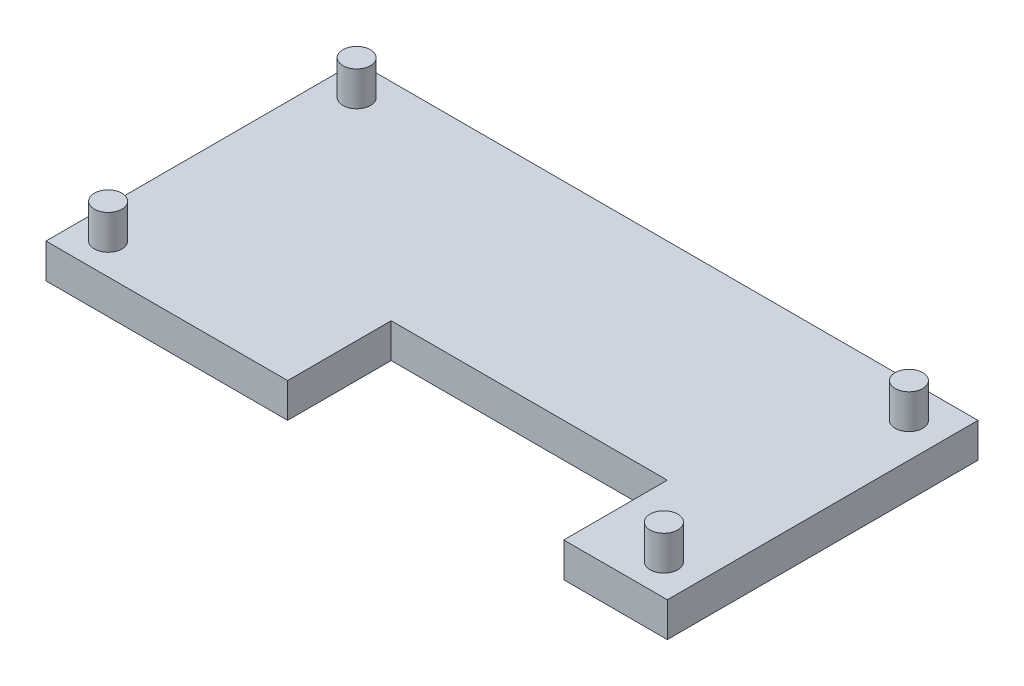
ISO-10303-21;
HEADER;
FILE_DESCRIPTION(('STEP AP214'),'2;1');
FILE_NAME('part.step','',(''),(''),'','','');
FILE_SCHEMA(('AUTOMOTIVE_DESIGN { 1 0 10303 214 1 1 1 1 }'));
ENDSEC;
DATA;
#1=APPLICATION_CONTEXT('core data for automotive mechanical design processes');
#2=APPLICATION_PROTOCOL_DEFINITION('international standard','automotive_design',2000,#1);
#3=PRODUCT_CONTEXT('',#1,'mechanical');
#4=PRODUCT('Part','Part','',(#3));
#5=PRODUCT_RELATED_PRODUCT_CATEGORY('part','',(#4));
#6=PRODUCT_DEFINITION_FORMATION('','',#4);
#7=PRODUCT_DEFINITION_CONTEXT('part definition',#1,'design');
#8=PRODUCT_DEFINITION('design','',#6,#7);
#9=PRODUCT_DEFINITION_SHAPE('','',#8);
#10=(LENGTH_UNIT() NAMED_UNIT(*) SI_UNIT(.MILLI.,.METRE.));
#11=(NAMED_UNIT(*) PLANE_ANGLE_UNIT() SI_UNIT($,.RADIAN.));
#12=(NAMED_UNIT(*) SI_UNIT($,.STERADIAN.) SOLID_ANGLE_UNIT());
#13=UNCERTAINTY_MEASURE_WITH_UNIT(LENGTH_MEASURE(1.E-05),#10,'distance_accuracy_value','');
#14=(GEOMETRIC_REPRESENTATION_CONTEXT(3) GLOBAL_UNCERTAINTY_ASSIGNED_CONTEXT((#13)) GLOBAL_UNIT_ASSIGNED_CONTEXT((#10,
#11,#12)) REPRESENTATION_CONTEXT('',''));
#15=CARTESIAN_POINT('',(0.,0.,0.));
#16=DIRECTION('',(0.,0.,1.));
#17=DIRECTION('',(1.,0.,0.));
#18=AXIS2_PLACEMENT_3D('',#15,#16,#17);
#19=CARTESIAN_POINT('',(0.,5.,18.3356643948266));
#20=DIRECTION('',(0.,0.,-1.));
#21=DIRECTION('',(-1.,0.,0.));
#22=AXIS2_PLACEMENT_3D('',#19,#20,#21);
#23=PLANE('',#22);
#24=DIRECTION('',(1.,0.,0.));
#25=VECTOR('',#24,1.);
#26=CARTESIAN_POINT('',(0.,0.,18.3356643948266));
#27=LINE('',#26,#25);
#28=CARTESIAN_POINT('',(83.912801806142,0.,18.3356643948266));
#29=VERTEX_POINT('',#28);
#30=CARTESIAN_POINT('',(98.912801806142,0.,18.3356643948266));
#31=VERTEX_POINT('',#30);
#32=EDGE_CURVE('E206',#29,#31,#27,.T.);
#33=ORIENTED_EDGE('',*,*,#32,.T.);
#34=DIRECTION('',(0.,-1.,0.));
#35=VECTOR('',#34,1.);
#36=CARTESIAN_POINT('',(98.912801806142,5.,18.3356643948266));
#37=LINE('',#36,#35);
#38=CARTESIAN_POINT('',(98.912801806142,5.,18.3356643948266));
#39=VERTEX_POINT('',#38);
#40=EDGE_CURVE('E74',#39,#31,#37,.T.);
#41=ORIENTED_EDGE('',*,*,#40,.F.);
#42=DIRECTION('',(1.,0.,0.));
#43=VECTOR('',#42,1.);
#44=CARTESIAN_POINT('',(0.,5.,18.3356643948266));
#45=LINE('',#44,#43);
#46=CARTESIAN_POINT('',(83.912801806142,5.,18.3356643948266));
#47=VERTEX_POINT('',#46);
#48=EDGE_CURVE('E156',#47,#39,#45,.T.);
#49=ORIENTED_EDGE('',*,*,#48,.F.);
#50=DIRECTION('',(0.,-1.,0.));
#51=VECTOR('',#50,1.);
#52=CARTESIAN_POINT('',(83.912801806142,5.,18.3356643948266));
#53=LINE('',#52,#51);
#54=EDGE_CURVE('E12',#47,#29,#53,.T.);
#55=ORIENTED_EDGE('',*,*,#54,.T.);
#56=EDGE_LOOP('',(#33,#41,#49,#55));
#57=FACE_BOUND('',#56,.T.);
#58=ADVANCED_FACE('F64',(#57),#23,.F.);
#59=CARTESIAN_POINT('',(98.912801806142,5.,0.));
#60=DIRECTION('',(1.,0.,0.));
#61=DIRECTION('',(0.,0.,-1.));
#62=AXIS2_PLACEMENT_3D('',#59,#60,#61);
#63=PLANE('',#62);
#64=DIRECTION('',(0.,0.,1.));
#65=VECTOR('',#64,1.);
#66=CARTESIAN_POINT('',(98.912801806142,0.,0.));
#67=LINE('',#66,#65);
#68=CARTESIAN_POINT('',(98.912801806142,0.,-26.6643356051734));
#69=VERTEX_POINT('',#68);
#70=EDGE_CURVE('E209',#69,#31,#67,.T.);
#71=ORIENTED_EDGE('',*,*,#70,.F.);
#72=DIRECTION('',(0.,-1.,0.));
#73=VECTOR('',#72,1.);
#74=CARTESIAN_POINT('',(98.912801806142,5.,-26.6643356051734));
#75=LINE('',#74,#73);
#76=CARTESIAN_POINT('',(98.912801806142,5.,-26.6643356051734));
#77=VERTEX_POINT('',#76);
#78=EDGE_CURVE('E167',#77,#69,#75,.T.);
#79=ORIENTED_EDGE('',*,*,#78,.F.);
#80=DIRECTION('',(0.,0.,1.));
#81=VECTOR('',#80,1.);
#82=CARTESIAN_POINT('',(98.912801806142,5.,0.));
#83=LINE('',#82,#81);
#84=EDGE_CURVE('E197',#77,#39,#83,.T.);
#85=ORIENTED_EDGE('',*,*,#84,.T.);
#86=ORIENTED_EDGE('',*,*,#40,.T.);
#87=EDGE_LOOP('',(#71,#79,#85,#86));
#88=FACE_BOUND('',#87,.T.);
#89=ADVANCED_FACE('F232',(#88),#63,.T.);
#90=CARTESIAN_POINT('',(0.,5.,-26.6643356051734));
#91=DIRECTION('',(0.,0.,-1.));
#92=DIRECTION('',(-1.,0.,0.));
#93=AXIS2_PLACEMENT_3D('',#90,#91,#92);
#94=PLANE('',#93);
#95=DIRECTION('',(1.,0.,0.));
#96=VECTOR('',#95,1.);
#97=CARTESIAN_POINT('',(0.,0.,-26.6643356051734));
#98=LINE('',#97,#96);
#99=CARTESIAN_POINT('',(8.912801806142,0.,-26.6643356051734));
#100=VERTEX_POINT('',#99);
#101=EDGE_CURVE('E212',#100,#69,#98,.T.);
#102=ORIENTED_EDGE('',*,*,#101,.F.);
#103=DIRECTION('',(0.,-1.,0.));
#104=VECTOR('',#103,1.);
#105=CARTESIAN_POINT('',(8.912801806142,5.,-26.6643356051734));
#106=LINE('',#105,#104);
#107=CARTESIAN_POINT('',(8.912801806142,5.,-26.6643356051734));
#108=VERTEX_POINT('',#107);
#109=EDGE_CURVE('E161',#108,#100,#106,.T.);
#110=ORIENTED_EDGE('',*,*,#109,.F.);
#111=DIRECTION('',(1.,0.,0.));
#112=VECTOR('',#111,1.);
#113=CARTESIAN_POINT('',(0.,5.,-26.6643356051734));
#114=LINE('',#113,#112);
#115=EDGE_CURVE('E200',#108,#77,#114,.T.);
#116=ORIENTED_EDGE('',*,*,#115,.T.);
#117=ORIENTED_EDGE('',*,*,#78,.T.);
#118=EDGE_LOOP('',(#102,#110,#116,#117));
#119=FACE_BOUND('',#118,.T.);
#120=ADVANCED_FACE('F238',(#119),#94,.T.);
#121=CARTESIAN_POINT('',(8.912801806142,5.,0.));
#122=DIRECTION('',(1.,0.,0.));
#123=DIRECTION('',(0.,0.,-1.));
#124=AXIS2_PLACEMENT_3D('',#121,#122,#123);
#125=PLANE('',#124);
#126=DIRECTION('',(0.,0.,1.));
#127=VECTOR('',#126,1.);
#128=CARTESIAN_POINT('',(8.912801806142,0.,0.));
#129=LINE('',#128,#127);
#130=CARTESIAN_POINT('',(8.912801806142,0.,18.3356643948266));
#131=VERTEX_POINT('',#130);
#132=EDGE_CURVE('E215',#100,#131,#129,.T.);
#133=ORIENTED_EDGE('',*,*,#132,.T.);
#134=DIRECTION('',(0.,-1.,0.));
#135=VECTOR('',#134,1.);
#136=CARTESIAN_POINT('',(8.912801806142,5.,18.3356643948266));
#137=LINE('',#136,#135);
#138=CARTESIAN_POINT('',(8.912801806142,5.,18.3356643948266));
#139=VERTEX_POINT('',#138);
#140=EDGE_CURVE('E159',#139,#131,#137,.T.);
#141=ORIENTED_EDGE('',*,*,#140,.F.);
#142=DIRECTION('',(0.,0.,1.));
#143=VECTOR('',#142,1.);
#144=CARTESIAN_POINT('',(8.912801806142,5.,0.));
#145=LINE('',#144,#143);
#146=EDGE_CURVE('E151',#108,#139,#145,.T.);
#147=ORIENTED_EDGE('',*,*,#146,.F.);
#148=ORIENTED_EDGE('',*,*,#109,.T.);
#149=EDGE_LOOP('',(#133,#141,#147,#148));
#150=FACE_BOUND('',#149,.T.);
#151=ADVANCED_FACE('F243',(#150),#125,.F.);
#152=CARTESIAN_POINT('',(43.912801806142,0.,18.3356643948266));
#153=VERTEX_POINT('',#152);
#154=EDGE_CURVE('E158',#131,#153,#27,.T.);
#155=ORIENTED_EDGE('',*,*,#154,.T.);
#156=DIRECTION('',(0.,-1.,0.));
#157=VECTOR('',#156,1.);
#158=CARTESIAN_POINT('',(43.912801806142,5.,18.3356643948266));
#159=LINE('',#158,#157);
#160=CARTESIAN_POINT('',(43.912801806142,5.,18.3356643948266));
#161=VERTEX_POINT('',#160);
#162=EDGE_CURVE('E142',#161,#153,#159,.T.);
#163=ORIENTED_EDGE('',*,*,#162,.F.);
#164=EDGE_CURVE('E145',#139,#161,#45,.T.);
#165=ORIENTED_EDGE('',*,*,#164,.F.);
#166=ORIENTED_EDGE('',*,*,#140,.T.);
#167=EDGE_LOOP('',(#155,#163,#165,#166));
#168=FACE_BOUND('',#167,.T.);
#169=ADVANCED_FACE('F157',(#168),#23,.F.);
#170=CARTESIAN_POINT('',(43.912801806142,5.,0.));
#171=DIRECTION('',(-1.,0.,0.));
#172=DIRECTION('',(0.,0.,1.));
#173=AXIS2_PLACEMENT_3D('',#170,#171,#172);
#174=PLANE('',#173);
#175=DIRECTION('',(0.,0.,-1.));
#176=VECTOR('',#175,1.);
#177=CARTESIAN_POINT('',(43.912801806142,0.,0.));
#178=LINE('',#177,#176);
#179=CARTESIAN_POINT('',(43.912801806142,0.,3.33566439482664));
#180=VERTEX_POINT('',#179);
#181=EDGE_CURVE('E218',#153,#180,#178,.T.);
#182=ORIENTED_EDGE('',*,*,#181,.T.);
#183=DIRECTION('',(0.,-1.,0.));
#184=VECTOR('',#183,1.);
#185=CARTESIAN_POINT('',(43.912801806142,5.,3.33566439482664));
#186=LINE('',#185,#184);
#187=CARTESIAN_POINT('',(43.912801806142,5.,3.33566439482664));
#188=VERTEX_POINT('',#187);
#189=EDGE_CURVE('E144',#188,#180,#186,.T.);
#190=ORIENTED_EDGE('',*,*,#189,.F.);
#191=DIRECTION('',(0.,0.,-1.));
#192=VECTOR('',#191,1.);
#193=CARTESIAN_POINT('',(43.912801806142,5.,0.));
#194=LINE('',#193,#192);
#195=EDGE_CURVE('E137',#161,#188,#194,.T.);
#196=ORIENTED_EDGE('',*,*,#195,.F.);
#197=ORIENTED_EDGE('',*,*,#162,.T.);
#198=EDGE_LOOP('',(#182,#190,#196,#197));
#199=FACE_BOUND('',#198,.T.);
#200=ADVANCED_FACE('F140',(#199),#174,.F.);
#201=CARTESIAN_POINT('',(0.,5.,3.33566439482664));
#202=DIRECTION('',(0.,0.,-1.));
#203=DIRECTION('',(-1.,0.,0.));
#204=AXIS2_PLACEMENT_3D('',#201,#202,#203);
#205=PLANE('',#204);
#206=DIRECTION('',(1.,0.,0.));
#207=VECTOR('',#206,1.);
#208=CARTESIAN_POINT('',(0.,0.,3.33566439482664));
#209=LINE('',#208,#207);
#210=CARTESIAN_POINT('',(83.912801806142,0.,3.33566439482664));
#211=VERTEX_POINT('',#210);
#212=EDGE_CURVE('E110',#180,#211,#209,.T.);
#213=ORIENTED_EDGE('',*,*,#212,.T.);
#214=DIRECTION('',(0.,-1.,0.));
#215=VECTOR('',#214,1.);
#216=CARTESIAN_POINT('',(83.912801806142,5.,3.33566439482664));
#217=LINE('',#216,#215);
#218=CARTESIAN_POINT('',(83.912801806142,5.,3.33566439482664));
#219=VERTEX_POINT('',#218);
#220=EDGE_CURVE('E117',#219,#211,#217,.T.);
#221=ORIENTED_EDGE('',*,*,#220,.F.);
#222=DIRECTION('',(1.,0.,0.));
#223=VECTOR('',#222,1.);
#224=CARTESIAN_POINT('',(0.,5.,3.33566439482664));
#225=LINE('',#224,#223);
#226=EDGE_CURVE('E83',#188,#219,#225,.T.);
#227=ORIENTED_EDGE('',*,*,#226,.F.);
#228=ORIENTED_EDGE('',*,*,#189,.T.);
#229=EDGE_LOOP('',(#213,#221,#227,#228));
#230=FACE_BOUND('',#229,.T.);
#231=ADVANCED_FACE('F221',(#230),#205,.F.);
#232=CARTESIAN_POINT('',(83.912801806142,5.,0.));
#233=DIRECTION('',(-1.,0.,0.));
#234=DIRECTION('',(0.,0.,1.));
#235=AXIS2_PLACEMENT_3D('',#232,#233,#234);
#236=PLANE('',#235);
#237=DIRECTION('',(0.,0.,-1.));
#238=VECTOR('',#237,1.);
#239=CARTESIAN_POINT('',(83.912801806142,0.,0.));
#240=LINE('',#239,#238);
#241=EDGE_CURVE('E173',#29,#211,#240,.T.);
#242=ORIENTED_EDGE('',*,*,#241,.F.);
#243=ORIENTED_EDGE('',*,*,#54,.F.);
#244=DIRECTION('',(0.,0.,-1.));
#245=VECTOR('',#244,1.);
#246=CARTESIAN_POINT('',(83.912801806142,5.,0.));
#247=LINE('',#246,#245);
#248=EDGE_CURVE('E195',#47,#219,#247,.T.);
#249=ORIENTED_EDGE('',*,*,#248,.T.);
#250=ORIENTED_EDGE('',*,*,#220,.T.);
#251=EDGE_LOOP('',(#242,#243,#249,#250));
#252=FACE_BOUND('',#251,.T.);
#253=ADVANCED_FACE('F66',(#252),#236,.T.);
#254=CARTESIAN_POINT('',(0.,0.,0.));
#255=DIRECTION('',(0.,1.,0.));
#256=DIRECTION('',(0.,0.,1.));
#257=AXIS2_PLACEMENT_3D('',#254,#255,#256);
#258=PLANE('',#257);
#259=ORIENTED_EDGE('',*,*,#241,.T.);
#260=ORIENTED_EDGE('',*,*,#212,.F.);
#261=ORIENTED_EDGE('',*,*,#181,.F.);
#262=ORIENTED_EDGE('',*,*,#154,.F.);
#263=ORIENTED_EDGE('',*,*,#132,.F.);
#264=ORIENTED_EDGE('',*,*,#101,.T.);
#265=ORIENTED_EDGE('',*,*,#70,.T.);
#266=ORIENTED_EDGE('',*,*,#32,.F.);
#267=EDGE_LOOP('',(#259,#260,#261,#262,#263,#264,#265,#266));
#268=FACE_BOUND('',#267,.T.);
#269=ADVANCED_FACE('F223',(#268),#258,.F.);
#270=CARTESIAN_POINT('',(0.,5.,0.));
#271=DIRECTION('',(0.,1.,0.));
#272=DIRECTION('',(0.,0.,1.));
#273=AXIS2_PLACEMENT_3D('',#270,#271,#272);
#274=PLANE('',#273);
#275=CARTESIAN_POINT('',(13.412801806142,5.,13.8356643948266));
#276=DIRECTION('',(0.,1.,0.));
#277=DIRECTION('',(0.,0.,1.));
#278=AXIS2_PLACEMENT_3D('',#275,#276,#277);
#279=CIRCLE('',#278,2.);
#280=CARTESIAN_POINT('',(13.412801806142,5.,15.8356643948266));
#281=VERTEX_POINT('',#280);
#282=EDGE_CURVE('E68',#281,#281,#279,.F.);
#283=ORIENTED_EDGE('',*,*,#282,.T.);
#284=EDGE_LOOP('',(#283));
#285=FACE_BOUND('',#284,.T.);
#286=CARTESIAN_POINT('',(93.912801806142,5.,13.8356643948265));
#287=DIRECTION('',(0.,1.,0.));
#288=DIRECTION('',(0.,0.,1.));
#289=AXIS2_PLACEMENT_3D('',#286,#287,#288);
#290=CIRCLE('',#289,2.);
#291=CARTESIAN_POINT('',(93.912801806142,5.,15.8356643948265));
#292=VERTEX_POINT('',#291);
#293=EDGE_CURVE('E178',#292,#292,#290,.F.);
#294=ORIENTED_EDGE('',*,*,#293,.T.);
#295=EDGE_LOOP('',(#294));
#296=FACE_BOUND('',#295,.T.);
#297=CARTESIAN_POINT('',(93.912801806142,5.,-21.6643356051735));
#298=DIRECTION('',(0.,1.,0.));
#299=DIRECTION('',(0.,0.,1.));
#300=AXIS2_PLACEMENT_3D('',#297,#298,#299);
#301=CIRCLE('',#300,2.);
#302=CARTESIAN_POINT('',(93.912801806142,5.,-19.6643356051735));
#303=VERTEX_POINT('',#302);
#304=EDGE_CURVE('E175',#303,#303,#301,.F.);
#305=ORIENTED_EDGE('',*,*,#304,.T.);
#306=EDGE_LOOP('',(#305));
#307=FACE_BOUND('',#306,.T.);
#308=CARTESIAN_POINT('',(13.412801806142,5.,-22.1643356051734));
#309=DIRECTION('',(0.,1.,0.));
#310=DIRECTION('',(0.,0.,1.));
#311=AXIS2_PLACEMENT_3D('',#308,#309,#310);
#312=CIRCLE('',#311,2.00000000000001);
#313=CARTESIAN_POINT('',(13.412801806142,5.,-20.1643356051734));
#314=VERTEX_POINT('',#313);
#315=EDGE_CURVE('E170',#314,#314,#312,.F.);
#316=ORIENTED_EDGE('',*,*,#315,.T.);
#317=EDGE_LOOP('',(#316));
#318=FACE_BOUND('',#317,.T.);
#319=ORIENTED_EDGE('',*,*,#248,.F.);
#320=ORIENTED_EDGE('',*,*,#48,.T.);
#321=ORIENTED_EDGE('',*,*,#84,.F.);
#322=ORIENTED_EDGE('',*,*,#115,.F.);
#323=ORIENTED_EDGE('',*,*,#146,.T.);
#324=ORIENTED_EDGE('',*,*,#164,.T.);
#325=ORIENTED_EDGE('',*,*,#195,.T.);
#326=ORIENTED_EDGE('',*,*,#226,.T.);
#327=EDGE_LOOP('',(#319,#320,#321,#322,#323,#324,#325,#326));
#328=FACE_BOUND('',#327,.T.);
#329=ADVANCED_FACE('F148',(#285,#296,#307,#318,#328),#274,.T.);
#330=CARTESIAN_POINT('',(13.412801806142,10.,-22.1643356051734));
#331=DIRECTION('',(0.,-1.,0.));
#332=DIRECTION('',(0.,0.,-1.));
#333=AXIS2_PLACEMENT_3D('',#330,#331,#332);
#334=CYLINDRICAL_SURFACE('',#333,2.00000000000001);
#335=ORIENTED_EDGE('',*,*,#315,.F.);
#336=EDGE_LOOP('',(#335));
#337=FACE_BOUND('',#336,.T.);
#338=CARTESIAN_POINT('',(13.412801806142,10.,-22.1643356051734));
#339=DIRECTION('',(0.,1.,0.));
#340=DIRECTION('',(0.,0.,1.));
#341=AXIS2_PLACEMENT_3D('',#338,#339,#340);
#342=CIRCLE('',#341,2.00000000000001);
#343=CARTESIAN_POINT('',(13.412801806142,10.,-20.1643356051734));
#344=VERTEX_POINT('',#343);
#345=EDGE_CURVE('E174',#344,#344,#342,.T.);
#346=ORIENTED_EDGE('',*,*,#345,.F.);
#347=EDGE_LOOP('',(#346));
#348=FACE_BOUND('',#347,.T.);
#349=ADVANCED_FACE('F311',(#337,#348),#334,.T.);
#350=CARTESIAN_POINT('',(0.,10.,0.));
#351=DIRECTION('',(0.,1.,0.));
#352=DIRECTION('',(0.,0.,1.));
#353=AXIS2_PLACEMENT_3D('',#350,#351,#352);
#354=PLANE('',#353);
#355=ORIENTED_EDGE('',*,*,#345,.T.);
#356=EDGE_LOOP('',(#355));
#357=FACE_BOUND('',#356,.T.);
#358=ADVANCED_FACE('F323',(#357),#354,.T.);
#359=CARTESIAN_POINT('',(93.912801806142,10.,-21.6643356051735));
#360=DIRECTION('',(0.,-1.,0.));
#361=DIRECTION('',(0.,0.,-1.));
#362=AXIS2_PLACEMENT_3D('',#359,#360,#361);
#363=CYLINDRICAL_SURFACE('',#362,2.);
#364=ORIENTED_EDGE('',*,*,#304,.F.);
#365=EDGE_LOOP('',(#364));
#366=FACE_BOUND('',#365,.T.);
#367=CARTESIAN_POINT('',(93.912801806142,10.,-21.6643356051735));
#368=DIRECTION('',(0.,1.,0.));
#369=DIRECTION('',(0.,0.,1.));
#370=AXIS2_PLACEMENT_3D('',#367,#368,#369);
#371=CIRCLE('',#370,2.);
#372=CARTESIAN_POINT('',(93.912801806142,10.,-19.6643356051735));
#373=VERTEX_POINT('',#372);
#374=EDGE_CURVE('E177',#373,#373,#371,.T.);
#375=ORIENTED_EDGE('',*,*,#374,.F.);
#376=EDGE_LOOP('',(#375));
#377=FACE_BOUND('',#376,.T.);
#378=ADVANCED_FACE('F332',(#366,#377),#363,.T.);
#379=CARTESIAN_POINT('',(0.,10.,0.));
#380=DIRECTION('',(0.,1.,0.));
#381=DIRECTION('',(0.,0.,1.));
#382=AXIS2_PLACEMENT_3D('',#379,#380,#381);
#383=PLANE('',#382);
#384=ORIENTED_EDGE('',*,*,#374,.T.);
#385=EDGE_LOOP('',(#384));
#386=FACE_BOUND('',#385,.T.);
#387=ADVANCED_FACE('F341',(#386),#383,.T.);
#388=CARTESIAN_POINT('',(93.912801806142,10.,13.8356643948265));
#389=DIRECTION('',(0.,-1.,0.));
#390=DIRECTION('',(0.,0.,-1.));
#391=AXIS2_PLACEMENT_3D('',#388,#389,#390);
#392=CYLINDRICAL_SURFACE('',#391,2.);
#393=ORIENTED_EDGE('',*,*,#293,.F.);
#394=EDGE_LOOP('',(#393));
#395=FACE_BOUND('',#394,.T.);
#396=CARTESIAN_POINT('',(93.912801806142,10.,13.8356643948265));
#397=DIRECTION('',(0.,1.,0.));
#398=DIRECTION('',(0.,0.,1.));
#399=AXIS2_PLACEMENT_3D('',#396,#397,#398);
#400=CIRCLE('',#399,2.);
#401=CARTESIAN_POINT('',(93.912801806142,10.,15.8356643948265));
#402=VERTEX_POINT('',#401);
#403=EDGE_CURVE('E180',#402,#402,#400,.T.);
#404=ORIENTED_EDGE('',*,*,#403,.F.);
#405=EDGE_LOOP('',(#404));
#406=FACE_BOUND('',#405,.T.);
#407=ADVANCED_FACE('F350',(#395,#406),#392,.T.);
#408=CARTESIAN_POINT('',(93.912801806142,10.,13.8356643948265));
#409=DIRECTION('',(0.,1.,0.));
#410=DIRECTION('',(0.,0.,1.));
#411=AXIS2_PLACEMENT_3D('',#408,#409,#410);
#412=PLANE('',#411);
#413=ORIENTED_EDGE('',*,*,#403,.T.);
#414=EDGE_LOOP('',(#413));
#415=FACE_BOUND('',#414,.T.);
#416=ADVANCED_FACE('F359',(#415),#412,.T.);
#417=CARTESIAN_POINT('',(13.412801806142,10.,13.8356643948266));
#418=DIRECTION('',(0.,-1.,0.));
#419=DIRECTION('',(0.,0.,-1.));
#420=AXIS2_PLACEMENT_3D('',#417,#418,#419);
#421=CYLINDRICAL_SURFACE('',#420,2.);
#422=ORIENTED_EDGE('',*,*,#282,.F.);
#423=EDGE_LOOP('',(#422));
#424=FACE_BOUND('',#423,.T.);
#425=CARTESIAN_POINT('',(13.412801806142,10.,13.8356643948266));
#426=DIRECTION('',(0.,1.,0.));
#427=DIRECTION('',(0.,0.,1.));
#428=AXIS2_PLACEMENT_3D('',#425,#426,#427);
#429=CIRCLE('',#428,2.);
#430=CARTESIAN_POINT('',(13.412801806142,10.,15.8356643948266));
#431=VERTEX_POINT('',#430);
#432=EDGE_CURVE('E190',#431,#431,#429,.T.);
#433=ORIENTED_EDGE('',*,*,#432,.F.);
#434=EDGE_LOOP('',(#433));
#435=FACE_BOUND('',#434,.T.);
#436=ADVANCED_FACE('F368',(#424,#435),#421,.T.);
#437=CARTESIAN_POINT('',(13.412801806142,10.,13.8356643948266));
#438=DIRECTION('',(0.,1.,0.));
#439=DIRECTION('',(0.,0.,1.));
#440=AXIS2_PLACEMENT_3D('',#437,#438,#439);
#441=PLANE('',#440);
#442=ORIENTED_EDGE('',*,*,#432,.T.);
#443=EDGE_LOOP('',(#442));
#444=FACE_BOUND('',#443,.T.);
#445=ADVANCED_FACE('F376',(#444),#441,.T.);
#446=CLOSED_SHELL('',(#58,#89,#120,#151,#169,#200,#231,#253,#269,#329,#349,#358,#378,#387,#407,
#416,#436,#445));
#447=MANIFOLD_SOLID_BREP('B2',#446);
#448=ADVANCED_BREP_SHAPE_REPRESENTATION('',(#18,#447),#14);
#449=SHAPE_DEFINITION_REPRESENTATION(#9,#448);
ENDSEC;
END-ISO-10303-21;
